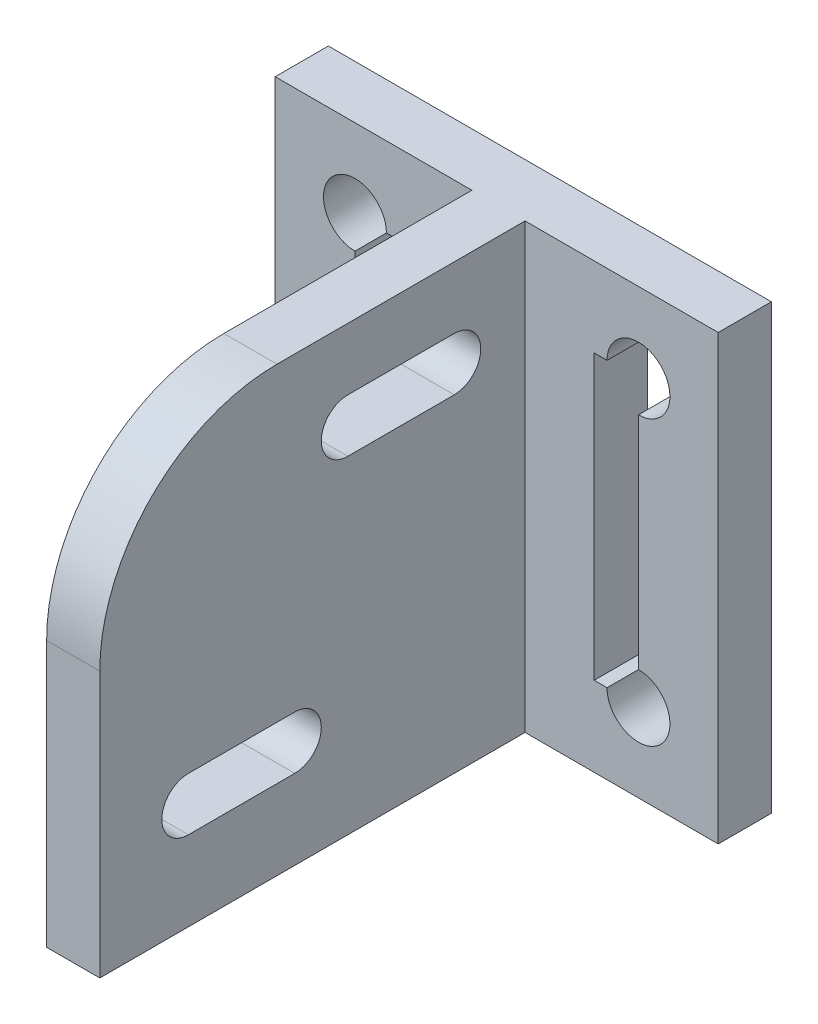
ISO-10303-21;
HEADER;
FILE_DESCRIPTION(('STEP AP214'),'2;1');
FILE_NAME('part.step','',(''),(''),'','','');
FILE_SCHEMA(('AUTOMOTIVE_DESIGN { 1 0 10303 214 1 1 1 1 }'));
ENDSEC;
DATA;
#1=APPLICATION_CONTEXT('core data for automotive mechanical design processes');
#2=APPLICATION_PROTOCOL_DEFINITION('international standard','automotive_design',2000,#1);
#3=PRODUCT_CONTEXT('',#1,'mechanical');
#4=PRODUCT('Part','Part','',(#3));
#5=PRODUCT_RELATED_PRODUCT_CATEGORY('part','',(#4));
#6=PRODUCT_DEFINITION_FORMATION('','',#4);
#7=PRODUCT_DEFINITION_CONTEXT('part definition',#1,'design');
#8=PRODUCT_DEFINITION('design','',#6,#7);
#9=PRODUCT_DEFINITION_SHAPE('','',#8);
#10=(LENGTH_UNIT() NAMED_UNIT(*) SI_UNIT(.MILLI.,.METRE.));
#11=(NAMED_UNIT(*) PLANE_ANGLE_UNIT() SI_UNIT($,.RADIAN.));
#12=(NAMED_UNIT(*) SI_UNIT($,.STERADIAN.) SOLID_ANGLE_UNIT());
#13=UNCERTAINTY_MEASURE_WITH_UNIT(LENGTH_MEASURE(1.E-05),#10,'distance_accuracy_value','');
#14=(GEOMETRIC_REPRESENTATION_CONTEXT(3) GLOBAL_UNCERTAINTY_ASSIGNED_CONTEXT((#13)) GLOBAL_UNIT_ASSIGNED_CONTEXT((#10,
#11,#12)) REPRESENTATION_CONTEXT('',''));
#15=CARTESIAN_POINT('',(0.,0.,0.));
#16=DIRECTION('',(0.,0.,1.));
#17=DIRECTION('',(1.,0.,0.));
#18=AXIS2_PLACEMENT_3D('',#15,#16,#17);
#19=CARTESIAN_POINT('',(0.,0.,3.));
#20=DIRECTION('',(0.,0.,-1.));
#21=DIRECTION('',(-1.,0.,0.));
#22=AXIS2_PLACEMENT_3D('',#19,#20,#21);
#23=PLANE('',#22);
#24=DIRECTION('',(0.,-1.,0.));
#25=VECTOR('',#24,1.);
#26=CARTESIAN_POINT('',(4.5,0.,3.));
#27=LINE('',#26,#25);
#28=CARTESIAN_POINT('',(4.5,18.7249999999999,3.));
#29=VERTEX_POINT('',#28);
#30=CARTESIAN_POINT('',(4.5,6.27500000000003,3.));
#31=VERTEX_POINT('',#30);
#32=EDGE_CURVE('E400',#29,#31,#27,.T.);
#33=ORIENTED_EDGE('',*,*,#32,.F.);
#34=CARTESIAN_POINT('',(4.5,20.5,3.));
#35=DIRECTION('',(0.,0.,-1.));
#36=DIRECTION('',(-1.,0.,0.));
#37=AXIS2_PLACEMENT_3D('',#34,#35,#36);
#38=CIRCLE('',#37,1.775);
#39=CARTESIAN_POINT('',(6.27500000000001,20.5,3.));
#40=VERTEX_POINT('',#39);
#41=EDGE_CURVE('E402',#29,#40,#38,.T.);
#42=ORIENTED_EDGE('',*,*,#41,.T.);
#43=DIRECTION('',(1.,0.,0.));
#44=VECTOR('',#43,1.);
#45=CARTESIAN_POINT('',(0.,20.5,3.));
#46=LINE('',#45,#44);
#47=CARTESIAN_POINT('',(7.00000000000001,20.5,3.));
#48=VERTEX_POINT('',#47);
#49=EDGE_CURVE('E351',#40,#48,#46,.T.);
#50=ORIENTED_EDGE('',*,*,#49,.T.);
#51=DIRECTION('',(0.,-1.,0.));
#52=VECTOR('',#51,1.);
#53=CARTESIAN_POINT('',(7.,0.,3.));
#54=LINE('',#53,#52);
#55=CARTESIAN_POINT('',(7.,4.49999999999995,3.));
#56=VERTEX_POINT('',#55);
#57=EDGE_CURVE('E392',#48,#56,#54,.T.);
#58=ORIENTED_EDGE('',*,*,#57,.T.);
#59=DIRECTION('',(1.,0.,0.));
#60=VECTOR('',#59,1.);
#61=CARTESIAN_POINT('',(0.,4.49999999999995,3.));
#62=LINE('',#61,#60);
#63=CARTESIAN_POINT('',(6.275,4.49999999999995,3.));
#64=VERTEX_POINT('',#63);
#65=EDGE_CURVE('E395',#64,#56,#62,.T.);
#66=ORIENTED_EDGE('',*,*,#65,.F.);
#67=CARTESIAN_POINT('',(4.5,4.49999999999995,3.));
#68=DIRECTION('',(0.,0.,-1.));
#69=DIRECTION('',(-1.,0.,0.));
#70=AXIS2_PLACEMENT_3D('',#67,#68,#69);
#71=CIRCLE('',#70,1.775);
#72=EDGE_CURVE('E397',#64,#31,#71,.T.);
#73=ORIENTED_EDGE('',*,*,#72,.T.);
#74=EDGE_LOOP('',(#33,#42,#50,#58,#66,#73));
#75=FACE_BOUND('',#74,.T.);
#76=DIRECTION('',(0.,-1.,0.));
#77=VECTOR('',#76,1.);
#78=CARTESIAN_POINT('',(11.0999999999924,0.,3.));
#79=LINE('',#78,#77);
#80=CARTESIAN_POINT('',(11.0999999999924,25.,3.));
#81=VERTEX_POINT('',#80);
#82=CARTESIAN_POINT('',(11.0999999999924,0.,3.));
#83=VERTEX_POINT('',#82);
#84=EDGE_CURVE('E306',#81,#83,#79,.T.);
#85=ORIENTED_EDGE('',*,*,#84,.F.);
#86=DIRECTION('',(-1.,0.,0.));
#87=VECTOR('',#86,1.);
#88=CARTESIAN_POINT('',(0.,25.,3.));
#89=LINE('',#88,#87);
#90=CARTESIAN_POINT('',(0.,25.,3.));
#91=VERTEX_POINT('',#90);
#92=EDGE_CURVE('E431',#81,#91,#89,.T.);
#93=ORIENTED_EDGE('',*,*,#92,.T.);
#94=DIRECTION('',(0.,-1.,0.));
#95=VECTOR('',#94,1.);
#96=CARTESIAN_POINT('',(0.,0.,3.));
#97=LINE('',#96,#95);
#98=CARTESIAN_POINT('',(0.,0.,3.));
#99=VERTEX_POINT('',#98);
#100=EDGE_CURVE('E422',#91,#99,#97,.T.);
#101=ORIENTED_EDGE('',*,*,#100,.T.);
#102=DIRECTION('',(1.,0.,0.));
#103=VECTOR('',#102,1.);
#104=CARTESIAN_POINT('',(0.,0.,3.));
#105=LINE('',#104,#103);
#106=EDGE_CURVE('E427',#99,#83,#105,.T.);
#107=ORIENTED_EDGE('',*,*,#106,.T.);
#108=EDGE_LOOP('',(#85,#93,#101,#107));
#109=FACE_BOUND('',#108,.T.);
#110=ADVANCED_FACE('F41',(#75,#109),#23,.F.);
#111=DIRECTION('',(0.,1.,0.));
#112=VECTOR('',#111,1.);
#113=CARTESIAN_POINT('',(20.5,0.,3.));
#114=LINE('',#113,#112);
#115=CARTESIAN_POINT('',(20.5,6.27500000000003,3.));
#116=VERTEX_POINT('',#115);
#117=CARTESIAN_POINT('',(20.5,18.7249999999999,3.));
#118=VERTEX_POINT('',#117);
#119=EDGE_CURVE('E416',#116,#118,#114,.T.);
#120=ORIENTED_EDGE('',*,*,#119,.F.);
#121=CARTESIAN_POINT('',(20.5,4.49999999999995,3.));
#122=DIRECTION('',(0.,0.,-1.));
#123=DIRECTION('',(-1.,0.,0.));
#124=AXIS2_PLACEMENT_3D('',#121,#122,#123);
#125=CIRCLE('',#124,1.775);
#126=CARTESIAN_POINT('',(18.725,4.49999999999995,3.));
#127=VERTEX_POINT('',#126);
#128=EDGE_CURVE('E418',#116,#127,#125,.T.);
#129=ORIENTED_EDGE('',*,*,#128,.T.);
#130=DIRECTION('',(-1.,0.,0.));
#131=VECTOR('',#130,1.);
#132=CARTESIAN_POINT('',(0.,4.49999999999995,3.));
#133=LINE('',#132,#131);
#134=CARTESIAN_POINT('',(18.,4.49999999999995,3.));
#135=VERTEX_POINT('',#134);
#136=EDGE_CURVE('E405',#127,#135,#133,.T.);
#137=ORIENTED_EDGE('',*,*,#136,.T.);
#138=DIRECTION('',(0.,1.,0.));
#139=VECTOR('',#138,1.);
#140=CARTESIAN_POINT('',(18.,0.,3.));
#141=LINE('',#140,#139);
#142=CARTESIAN_POINT('',(18.,20.5,3.));
#143=VERTEX_POINT('',#142);
#144=EDGE_CURVE('E408',#135,#143,#141,.T.);
#145=ORIENTED_EDGE('',*,*,#144,.T.);
#146=DIRECTION('',(-1.,0.,0.));
#147=VECTOR('',#146,1.);
#148=CARTESIAN_POINT('',(0.,20.5,3.));
#149=LINE('',#148,#147);
#150=CARTESIAN_POINT('',(18.725,20.5,3.));
#151=VERTEX_POINT('',#150);
#152=EDGE_CURVE('E411',#151,#143,#149,.T.);
#153=ORIENTED_EDGE('',*,*,#152,.F.);
#154=CARTESIAN_POINT('',(20.5,20.5,3.));
#155=DIRECTION('',(0.,0.,-1.));
#156=DIRECTION('',(-1.,0.,0.));
#157=AXIS2_PLACEMENT_3D('',#154,#155,#156);
#158=CIRCLE('',#157,1.775);
#159=EDGE_CURVE('E413',#151,#118,#158,.T.);
#160=ORIENTED_EDGE('',*,*,#159,.T.);
#161=EDGE_LOOP('',(#120,#129,#137,#145,#153,#160));
#162=FACE_BOUND('',#161,.T.);
#163=DIRECTION('',(0.,1.,0.));
#164=VECTOR('',#163,1.);
#165=CARTESIAN_POINT('',(14.0999999999924,0.,3.));
#166=LINE('',#165,#164);
#167=CARTESIAN_POINT('',(14.0999999999924,0.,3.));
#168=VERTEX_POINT('',#167);
#169=CARTESIAN_POINT('',(14.0999999999924,25.,3.));
#170=VERTEX_POINT('',#169);
#171=EDGE_CURVE('E310',#168,#170,#166,.T.);
#172=ORIENTED_EDGE('',*,*,#171,.F.);
#173=CARTESIAN_POINT('',(25.,0.,3.));
#174=VERTEX_POINT('',#173);
#175=EDGE_CURVE('E425',#168,#174,#105,.T.);
#176=ORIENTED_EDGE('',*,*,#175,.T.);
#177=DIRECTION('',(0.,1.,0.));
#178=VECTOR('',#177,1.);
#179=CARTESIAN_POINT('',(25.,0.,3.));
#180=LINE('',#179,#178);
#181=CARTESIAN_POINT('',(25.,25.,3.));
#182=VERTEX_POINT('',#181);
#183=EDGE_CURVE('E429',#174,#182,#180,.T.);
#184=ORIENTED_EDGE('',*,*,#183,.T.);
#185=EDGE_CURVE('E432',#182,#170,#89,.T.);
#186=ORIENTED_EDGE('',*,*,#185,.T.);
#187=EDGE_LOOP('',(#172,#176,#184,#186));
#188=FACE_BOUND('',#187,.T.);
#189=ADVANCED_FACE('F480',(#162,#188),#23,.F.);
#190=CARTESIAN_POINT('',(0.,0.,3.));
#191=DIRECTION('',(1.,0.,0.));
#192=DIRECTION('',(0.,1.,0.));
#193=AXIS2_PLACEMENT_3D('',#190,#191,#192);
#194=PLANE('',#193);
#195=DIRECTION('',(0.,-1.,0.));
#196=VECTOR('',#195,1.);
#197=CARTESIAN_POINT('',(0.,0.,0.));
#198=LINE('',#197,#196);
#199=CARTESIAN_POINT('',(0.,25.,0.));
#200=VERTEX_POINT('',#199);
#201=CARTESIAN_POINT('',(0.,0.,0.));
#202=VERTEX_POINT('',#201);
#203=EDGE_CURVE('E421',#200,#202,#198,.T.);
#204=ORIENTED_EDGE('',*,*,#203,.T.);
#205=DIRECTION('',(0.,0.,-1.));
#206=VECTOR('',#205,1.);
#207=CARTESIAN_POINT('',(0.,0.,3.));
#208=LINE('',#207,#206);
#209=EDGE_CURVE('E451',#99,#202,#208,.T.);
#210=ORIENTED_EDGE('',*,*,#209,.F.);
#211=ORIENTED_EDGE('',*,*,#100,.F.);
#212=DIRECTION('',(0.,0.,-1.));
#213=VECTOR('',#212,1.);
#214=CARTESIAN_POINT('',(0.,25.,3.));
#215=LINE('',#214,#213);
#216=EDGE_CURVE('E435',#91,#200,#215,.T.);
#217=ORIENTED_EDGE('',*,*,#216,.T.);
#218=EDGE_LOOP('',(#204,#210,#211,#217));
#219=FACE_BOUND('',#218,.T.);
#220=ADVANCED_FACE('F487',(#219),#194,.F.);
#221=CARTESIAN_POINT('',(0.,0.,3.));
#222=DIRECTION('',(0.,1.,0.));
#223=DIRECTION('',(0.,0.,1.));
#224=AXIS2_PLACEMENT_3D('',#221,#222,#223);
#225=PLANE('',#224);
#226=DIRECTION('',(1.,0.,0.));
#227=VECTOR('',#226,1.);
#228=CARTESIAN_POINT('',(0.,0.,0.));
#229=LINE('',#228,#227);
#230=CARTESIAN_POINT('',(25.,0.,0.));
#231=VERTEX_POINT('',#230);
#232=EDGE_CURVE('E438',#202,#231,#229,.T.);
#233=ORIENTED_EDGE('',*,*,#232,.T.);
#234=DIRECTION('',(0.,0.,-1.));
#235=VECTOR('',#234,1.);
#236=CARTESIAN_POINT('',(25.,0.,3.));
#237=LINE('',#236,#235);
#238=EDGE_CURVE('E448',#174,#231,#237,.T.);
#239=ORIENTED_EDGE('',*,*,#238,.F.);
#240=ORIENTED_EDGE('',*,*,#175,.F.);
#241=DIRECTION('',(0.,0.,-1.));
#242=VECTOR('',#241,1.);
#243=CARTESIAN_POINT('',(14.0999999999924,0.,27.));
#244=LINE('',#243,#242);
#245=CARTESIAN_POINT('',(14.0999999999924,0.,27.));
#246=VERTEX_POINT('',#245);
#247=EDGE_CURVE('E323',#246,#168,#244,.T.);
#248=ORIENTED_EDGE('',*,*,#247,.F.);
#249=DIRECTION('',(1.,0.,0.));
#250=VECTOR('',#249,1.);
#251=CARTESIAN_POINT('',(11.0999999999924,0.,27.));
#252=LINE('',#251,#250);
#253=CARTESIAN_POINT('',(11.0999999999924,0.,27.));
#254=VERTEX_POINT('',#253);
#255=EDGE_CURVE('E309',#254,#246,#252,.T.);
#256=ORIENTED_EDGE('',*,*,#255,.F.);
#257=DIRECTION('',(0.,0.,-1.));
#258=VECTOR('',#257,1.);
#259=CARTESIAN_POINT('',(11.0999999999924,0.,27.));
#260=LINE('',#259,#258);
#261=EDGE_CURVE('E326',#254,#83,#260,.T.);
#262=ORIENTED_EDGE('',*,*,#261,.T.);
#263=ORIENTED_EDGE('',*,*,#106,.F.);
#264=ORIENTED_EDGE('',*,*,#209,.T.);
#265=EDGE_LOOP('',(#233,#239,#240,#248,#256,#262,#263,#264));
#266=FACE_BOUND('',#265,.T.);
#267=ADVANCED_FACE('F468',(#266),#225,.F.);
#268=CARTESIAN_POINT('',(25.,0.,3.));
#269=DIRECTION('',(-1.,0.,0.));
#270=DIRECTION('',(0.,0.,1.));
#271=AXIS2_PLACEMENT_3D('',#268,#269,#270);
#272=PLANE('',#271);
#273=DIRECTION('',(0.,1.,0.));
#274=VECTOR('',#273,1.);
#275=CARTESIAN_POINT('',(25.,0.,0.));
#276=LINE('',#275,#274);
#277=CARTESIAN_POINT('',(25.,25.,0.));
#278=VERTEX_POINT('',#277);
#279=EDGE_CURVE('E440',#231,#278,#276,.T.);
#280=ORIENTED_EDGE('',*,*,#279,.T.);
#281=DIRECTION('',(0.,0.,-1.));
#282=VECTOR('',#281,1.);
#283=CARTESIAN_POINT('',(25.,25.,3.));
#284=LINE('',#283,#282);
#285=EDGE_CURVE('E445',#182,#278,#284,.T.);
#286=ORIENTED_EDGE('',*,*,#285,.F.);
#287=ORIENTED_EDGE('',*,*,#183,.F.);
#288=ORIENTED_EDGE('',*,*,#238,.T.);
#289=EDGE_LOOP('',(#280,#286,#287,#288));
#290=FACE_BOUND('',#289,.T.);
#291=ADVANCED_FACE('F502',(#290),#272,.F.);
#292=CARTESIAN_POINT('',(0.,25.,3.));
#293=DIRECTION('',(0.,-1.,0.));
#294=DIRECTION('',(0.,0.,-1.));
#295=AXIS2_PLACEMENT_3D('',#292,#293,#294);
#296=PLANE('',#295);
#297=DIRECTION('',(0.,0.,-1.));
#298=VECTOR('',#297,1.);
#299=CARTESIAN_POINT('',(11.0999999999924,25.,27.));
#300=LINE('',#299,#298);
#301=CARTESIAN_POINT('',(11.0999999999924,25.,17.));
#302=VERTEX_POINT('',#301);
#303=EDGE_CURVE('E315',#302,#81,#300,.T.);
#304=ORIENTED_EDGE('',*,*,#303,.F.);
#305=DIRECTION('',(-1.,0.,0.));
#306=VECTOR('',#305,1.);
#307=CARTESIAN_POINT('',(0.,25.,17.));
#308=LINE('',#307,#306);
#309=CARTESIAN_POINT('',(14.0999999999924,25.,17.));
#310=VERTEX_POINT('',#309);
#311=EDGE_CURVE('E49',#302,#310,#308,.F.);
#312=ORIENTED_EDGE('',*,*,#311,.T.);
#313=DIRECTION('',(0.,0.,-1.));
#314=VECTOR('',#313,1.);
#315=CARTESIAN_POINT('',(14.0999999999924,25.,27.));
#316=LINE('',#315,#314);
#317=EDGE_CURVE('E321',#310,#170,#316,.T.);
#318=ORIENTED_EDGE('',*,*,#317,.T.);
#319=ORIENTED_EDGE('',*,*,#185,.F.);
#320=ORIENTED_EDGE('',*,*,#285,.T.);
#321=DIRECTION('',(-1.,0.,0.));
#322=VECTOR('',#321,1.);
#323=CARTESIAN_POINT('',(0.,25.,0.));
#324=LINE('',#323,#322);
#325=EDGE_CURVE('E426',#278,#200,#324,.T.);
#326=ORIENTED_EDGE('',*,*,#325,.T.);
#327=ORIENTED_EDGE('',*,*,#216,.F.);
#328=ORIENTED_EDGE('',*,*,#92,.F.);
#329=EDGE_LOOP('',(#304,#312,#318,#319,#320,#326,#327,#328));
#330=FACE_BOUND('',#329,.T.);
#331=ADVANCED_FACE('F498',(#330),#296,.F.);
#332=CARTESIAN_POINT('',(0.,0.,0.));
#333=DIRECTION('',(0.,0.,-1.));
#334=DIRECTION('',(-1.,0.,0.));
#335=AXIS2_PLACEMENT_3D('',#332,#333,#334);
#336=PLANE('',#335);
#337=CARTESIAN_POINT('',(20.5,4.49999999999995,-1.196959198424E-13));
#338=DIRECTION('',(0.,0.,-1.));
#339=DIRECTION('',(-1.,0.,0.));
#340=AXIS2_PLACEMENT_3D('',#337,#338,#339);
#341=CIRCLE('',#340,1.775);
#342=CARTESIAN_POINT('',(20.5,6.27500000000003,0.));
#343=VERTEX_POINT('',#342);
#344=CARTESIAN_POINT('',(18.725,4.49999999999995,0.));
#345=VERTEX_POINT('',#344);
#346=EDGE_CURVE('E330',#343,#345,#341,.T.);
#347=ORIENTED_EDGE('',*,*,#346,.F.);
#348=DIRECTION('',(0.,1.,0.));
#349=VECTOR('',#348,1.);
#350=CARTESIAN_POINT('',(20.5,0.,0.));
#351=LINE('',#350,#349);
#352=CARTESIAN_POINT('',(20.5,18.7249999999999,-2.72351585728359E-13));
#353=VERTEX_POINT('',#352);
#354=EDGE_CURVE('E345',#343,#353,#351,.T.);
#355=ORIENTED_EDGE('',*,*,#354,.T.);
#356=CARTESIAN_POINT('',(20.5,20.5,-3.72965547335014E-13));
#357=DIRECTION('',(0.,0.,-1.));
#358=DIRECTION('',(-1.,0.,0.));
#359=AXIS2_PLACEMENT_3D('',#356,#357,#358);
#360=CIRCLE('',#359,1.775);
#361=CARTESIAN_POINT('',(18.725,20.5,-2.72351585728359E-13));
#362=VERTEX_POINT('',#361);
#363=EDGE_CURVE('E342',#362,#353,#360,.T.);
#364=ORIENTED_EDGE('',*,*,#363,.F.);
#365=DIRECTION('',(-1.,0.,0.));
#366=VECTOR('',#365,1.);
#367=CARTESIAN_POINT('',(0.,20.5,0.));
#368=LINE('',#367,#366);
#369=CARTESIAN_POINT('',(18.,20.5,0.));
#370=VERTEX_POINT('',#369);
#371=EDGE_CURVE('E339',#362,#370,#368,.T.);
#372=ORIENTED_EDGE('',*,*,#371,.T.);
#373=DIRECTION('',(0.,1.,0.));
#374=VECTOR('',#373,1.);
#375=CARTESIAN_POINT('',(18.,0.,0.));
#376=LINE('',#375,#374);
#377=CARTESIAN_POINT('',(18.,4.49999999999995,0.));
#378=VERTEX_POINT('',#377);
#379=EDGE_CURVE('E336',#378,#370,#376,.T.);
#380=ORIENTED_EDGE('',*,*,#379,.F.);
#381=DIRECTION('',(-1.,0.,0.));
#382=VECTOR('',#381,1.);
#383=CARTESIAN_POINT('',(0.,4.49999999999995,0.));
#384=LINE('',#383,#382);
#385=EDGE_CURVE('E332',#345,#378,#384,.T.);
#386=ORIENTED_EDGE('',*,*,#385,.F.);
#387=EDGE_LOOP('',(#347,#355,#364,#372,#380,#386));
#388=FACE_BOUND('',#387,.T.);
#389=CARTESIAN_POINT('',(4.5,20.5,-4.9439619065339E-13));
#390=DIRECTION('',(0.,0.,-1.));
#391=DIRECTION('',(-1.,0.,0.));
#392=AXIS2_PLACEMENT_3D('',#389,#390,#391);
#393=CIRCLE('',#392,1.775);
#394=CARTESIAN_POINT('',(4.5,18.7249999999999,-5.13478148889135E-13));
#395=VERTEX_POINT('',#394);
#396=CARTESIAN_POINT('',(6.27500000000001,20.5,0.));
#397=VERTEX_POINT('',#396);
#398=EDGE_CURVE('E329',#395,#397,#393,.T.);
#399=ORIENTED_EDGE('',*,*,#398,.F.);
#400=DIRECTION('',(0.,-1.,0.));
#401=VECTOR('',#400,1.);
#402=CARTESIAN_POINT('',(4.5,0.,0.));
#403=LINE('',#402,#401);
#404=CARTESIAN_POINT('',(4.5,6.27500000000003,0.));
#405=VERTEX_POINT('',#404);
#406=EDGE_CURVE('E375',#395,#405,#403,.T.);
#407=ORIENTED_EDGE('',*,*,#406,.T.);
#408=CARTESIAN_POINT('',(4.5,4.49999999999995,-6.41847686111419E-13));
#409=DIRECTION('',(0.,0.,-1.));
#410=DIRECTION('',(-1.,0.,0.));
#411=AXIS2_PLACEMENT_3D('',#408,#409,#410);
#412=CIRCLE('',#411,1.775);
#413=CARTESIAN_POINT('',(6.275,4.49999999999995,-6.08887940067859E-13));
#414=VERTEX_POINT('',#413);
#415=EDGE_CURVE('E372',#414,#405,#412,.T.);
#416=ORIENTED_EDGE('',*,*,#415,.F.);
#417=DIRECTION('',(1.,0.,0.));
#418=VECTOR('',#417,1.);
#419=CARTESIAN_POINT('',(0.,4.49999999999995,-5.39499001028787E-13));
#420=LINE('',#419,#418);
#421=CARTESIAN_POINT('',(7.,4.49999999999995,-5.39499001028787E-13));
#422=VERTEX_POINT('',#421);
#423=EDGE_CURVE('E369',#414,#422,#420,.T.);
#424=ORIENTED_EDGE('',*,*,#423,.T.);
#425=DIRECTION('',(0.,-1.,0.));
#426=VECTOR('',#425,1.);
#427=CARTESIAN_POINT('',(7.,0.,0.));
#428=LINE('',#427,#426);
#429=CARTESIAN_POINT('',(7.00000000000001,20.5,-5.39499001028787E-13));
#430=VERTEX_POINT('',#429);
#431=EDGE_CURVE('E366',#430,#422,#428,.T.);
#432=ORIENTED_EDGE('',*,*,#431,.F.);
#433=DIRECTION('',(1.,0.,0.));
#434=VECTOR('',#433,1.);
#435=CARTESIAN_POINT('',(0.,20.5,-5.39499001028787E-13));
#436=LINE('',#435,#434);
#437=EDGE_CURVE('E363',#397,#430,#436,.T.);
#438=ORIENTED_EDGE('',*,*,#437,.F.);
#439=EDGE_LOOP('',(#399,#407,#416,#424,#432,#438));
#440=FACE_BOUND('',#439,.T.);
#441=ORIENTED_EDGE('',*,*,#203,.F.);
#442=ORIENTED_EDGE('',*,*,#325,.F.);
#443=ORIENTED_EDGE('',*,*,#279,.F.);
#444=ORIENTED_EDGE('',*,*,#232,.F.);
#445=EDGE_LOOP('',(#441,#442,#443,#444));
#446=FACE_BOUND('',#445,.T.);
#447=ADVANCED_FACE('F495',(#388,#440,#446),#336,.T.);
#448=CARTESIAN_POINT('',(4.5,20.5,9.99999999999951));
#449=DIRECTION('',(0.,0.,-1.));
#450=DIRECTION('',(-1.,0.,0.));
#451=AXIS2_PLACEMENT_3D('',#448,#449,#450);
#452=CYLINDRICAL_SURFACE('',#451,1.775);
#453=DIRECTION('',(0.,0.,-1.));
#454=VECTOR('',#453,1.);
#455=CARTESIAN_POINT('',(4.5,18.7249999999999,9.99999999999949));
#456=LINE('',#455,#454);
#457=EDGE_CURVE('E333',#29,#395,#456,.T.);
#458=ORIENTED_EDGE('',*,*,#457,.T.);
#459=ORIENTED_EDGE('',*,*,#398,.T.);
#460=DIRECTION('',(0.,0.,-1.));
#461=VECTOR('',#460,1.);
#462=CARTESIAN_POINT('',(6.27500000000001,20.5,9.99999999999949));
#463=LINE('',#462,#461);
#464=EDGE_CURVE('E378',#40,#397,#463,.T.);
#465=ORIENTED_EDGE('',*,*,#464,.F.);
#466=ORIENTED_EDGE('',*,*,#41,.F.);
#467=EDGE_LOOP('',(#458,#459,#465,#466));
#468=FACE_BOUND('',#467,.T.);
#469=ADVANCED_FACE('F493',(#468),#452,.F.);
#470=CARTESIAN_POINT('',(4.5,0.,10.));
#471=DIRECTION('',(1.,0.,0.));
#472=DIRECTION('',(0.,1.,0.));
#473=AXIS2_PLACEMENT_3D('',#470,#471,#472);
#474=PLANE('',#473);
#475=ORIENTED_EDGE('',*,*,#32,.T.);
#476=DIRECTION('',(0.,0.,-1.));
#477=VECTOR('',#476,1.);
#478=CARTESIAN_POINT('',(4.5,6.27500000000003,10.));
#479=LINE('',#478,#477);
#480=EDGE_CURVE('E380',#31,#405,#479,.T.);
#481=ORIENTED_EDGE('',*,*,#480,.T.);
#482=ORIENTED_EDGE('',*,*,#406,.F.);
#483=ORIENTED_EDGE('',*,*,#457,.F.);
#484=EDGE_LOOP('',(#475,#481,#482,#483));
#485=FACE_BOUND('',#484,.T.);
#486=ADVANCED_FACE('F542',(#485),#474,.T.);
#487=CARTESIAN_POINT('',(4.5,4.49999999999995,9.99999999999936));
#488=DIRECTION('',(0.,0.,-1.));
#489=DIRECTION('',(-1.,0.,0.));
#490=AXIS2_PLACEMENT_3D('',#487,#488,#489);
#491=CYLINDRICAL_SURFACE('',#490,1.775);
#492=DIRECTION('',(0.,0.,-1.));
#493=VECTOR('',#492,1.);
#494=CARTESIAN_POINT('',(6.275,4.49999999999995,9.99999999999939));
#495=LINE('',#494,#493);
#496=EDGE_CURVE('E382',#64,#414,#495,.T.);
#497=ORIENTED_EDGE('',*,*,#496,.T.);
#498=ORIENTED_EDGE('',*,*,#415,.T.);
#499=ORIENTED_EDGE('',*,*,#480,.F.);
#500=ORIENTED_EDGE('',*,*,#72,.F.);
#501=EDGE_LOOP('',(#497,#498,#499,#500));
#502=FACE_BOUND('',#501,.T.);
#503=ADVANCED_FACE('F550',(#502),#491,.F.);
#504=CARTESIAN_POINT('',(0.,4.49999999999995,9.99999999999946));
#505=DIRECTION('',(0.,1.,0.));
#506=DIRECTION('',(-1.,0.,0.));
#507=AXIS2_PLACEMENT_3D('',#504,#505,#506);
#508=PLANE('',#507);
#509=ORIENTED_EDGE('',*,*,#65,.T.);
#510=DIRECTION('',(0.,0.,-1.));
#511=VECTOR('',#510,1.);
#512=CARTESIAN_POINT('',(7.,4.49999999999995,9.99999999999946));
#513=LINE('',#512,#511);
#514=EDGE_CURVE('E384',#56,#422,#513,.T.);
#515=ORIENTED_EDGE('',*,*,#514,.T.);
#516=ORIENTED_EDGE('',*,*,#423,.F.);
#517=ORIENTED_EDGE('',*,*,#496,.F.);
#518=EDGE_LOOP('',(#509,#515,#516,#517));
#519=FACE_BOUND('',#518,.T.);
#520=ADVANCED_FACE('F559',(#519),#508,.T.);
#521=CARTESIAN_POINT('',(7.,0.,10.));
#522=DIRECTION('',(1.,0.,0.));
#523=DIRECTION('',(0.,1.,0.));
#524=AXIS2_PLACEMENT_3D('',#521,#522,#523);
#525=PLANE('',#524);
#526=DIRECTION('',(0.,0.,-1.));
#527=VECTOR('',#526,1.);
#528=CARTESIAN_POINT('',(7.00000000000001,20.5,9.99999999999946));
#529=LINE('',#528,#527);
#530=EDGE_CURVE('E386',#48,#430,#529,.T.);
#531=ORIENTED_EDGE('',*,*,#530,.T.);
#532=ORIENTED_EDGE('',*,*,#431,.T.);
#533=ORIENTED_EDGE('',*,*,#514,.F.);
#534=ORIENTED_EDGE('',*,*,#57,.F.);
#535=EDGE_LOOP('',(#531,#532,#533,#534));
#536=FACE_BOUND('',#535,.T.);
#537=ADVANCED_FACE('F568',(#536),#525,.F.);
#538=CARTESIAN_POINT('',(0.,20.5,9.99999999999946));
#539=DIRECTION('',(0.,1.,0.));
#540=DIRECTION('',(-1.,0.,0.));
#541=AXIS2_PLACEMENT_3D('',#538,#539,#540);
#542=PLANE('',#541);
#543=ORIENTED_EDGE('',*,*,#464,.T.);
#544=ORIENTED_EDGE('',*,*,#437,.T.);
#545=ORIENTED_EDGE('',*,*,#530,.F.);
#546=ORIENTED_EDGE('',*,*,#49,.F.);
#547=EDGE_LOOP('',(#543,#544,#545,#546));
#548=FACE_BOUND('',#547,.T.);
#549=ADVANCED_FACE('F577',(#548),#542,.F.);
#550=CARTESIAN_POINT('',(20.5,4.49999999999995,9.99999999999988));
#551=DIRECTION('',(0.,0.,-1.));
#552=DIRECTION('',(-1.,0.,0.));
#553=AXIS2_PLACEMENT_3D('',#550,#551,#552);
#554=CYLINDRICAL_SURFACE('',#553,1.775);
#555=DIRECTION('',(0.,0.,-1.));
#556=VECTOR('',#555,1.);
#557=CARTESIAN_POINT('',(20.5,6.27500000000003,10.));
#558=LINE('',#557,#556);
#559=EDGE_CURVE('E349',#116,#343,#558,.T.);
#560=ORIENTED_EDGE('',*,*,#559,.T.);
#561=ORIENTED_EDGE('',*,*,#346,.T.);
#562=DIRECTION('',(0.,0.,-1.));
#563=VECTOR('',#562,1.);
#564=CARTESIAN_POINT('',(18.725,4.49999999999995,9.99999999999994));
#565=LINE('',#564,#563);
#566=EDGE_CURVE('E348',#127,#345,#565,.T.);
#567=ORIENTED_EDGE('',*,*,#566,.F.);
#568=ORIENTED_EDGE('',*,*,#128,.F.);
#569=EDGE_LOOP('',(#560,#561,#567,#568));
#570=FACE_BOUND('',#569,.T.);
#571=ADVANCED_FACE('F586',(#570),#554,.F.);
#572=CARTESIAN_POINT('',(20.5,0.,10.));
#573=DIRECTION('',(-1.,0.,0.));
#574=DIRECTION('',(0.,-1.,0.));
#575=AXIS2_PLACEMENT_3D('',#572,#573,#574);
#576=PLANE('',#575);
#577=ORIENTED_EDGE('',*,*,#119,.T.);
#578=DIRECTION('',(0.,0.,-1.));
#579=VECTOR('',#578,1.);
#580=CARTESIAN_POINT('',(20.5,18.7249999999999,9.99999999999973));
#581=LINE('',#580,#579);
#582=EDGE_CURVE('E352',#118,#353,#581,.T.);
#583=ORIENTED_EDGE('',*,*,#582,.T.);
#584=ORIENTED_EDGE('',*,*,#354,.F.);
#585=ORIENTED_EDGE('',*,*,#559,.F.);
#586=EDGE_LOOP('',(#577,#583,#584,#585));
#587=FACE_BOUND('',#586,.T.);
#588=ADVANCED_FACE('F594',(#587),#576,.T.);
#589=CARTESIAN_POINT('',(20.5,20.5,9.99999999999963));
#590=DIRECTION('',(0.,0.,-1.));
#591=DIRECTION('',(-1.,0.,0.));
#592=AXIS2_PLACEMENT_3D('',#589,#590,#591);
#593=CYLINDRICAL_SURFACE('',#592,1.775);
#594=DIRECTION('',(0.,0.,-1.));
#595=VECTOR('',#594,1.);
#596=CARTESIAN_POINT('',(18.725,20.5,9.99999999999973));
#597=LINE('',#596,#595);
#598=EDGE_CURVE('E354',#151,#362,#597,.T.);
#599=ORIENTED_EDGE('',*,*,#598,.T.);
#600=ORIENTED_EDGE('',*,*,#363,.T.);
#601=ORIENTED_EDGE('',*,*,#582,.F.);
#602=ORIENTED_EDGE('',*,*,#159,.F.);
#603=EDGE_LOOP('',(#599,#600,#601,#602));
#604=FACE_BOUND('',#603,.T.);
#605=ADVANCED_FACE('F603',(#604),#593,.F.);
#606=CARTESIAN_POINT('',(0.,20.5,9.99999999999999));
#607=DIRECTION('',(0.,-1.,0.));
#608=DIRECTION('',(1.,0.,0.));
#609=AXIS2_PLACEMENT_3D('',#606,#607,#608);
#610=PLANE('',#609);
#611=ORIENTED_EDGE('',*,*,#152,.T.);
#612=DIRECTION('',(0.,0.,-1.));
#613=VECTOR('',#612,1.);
#614=CARTESIAN_POINT('',(18.,20.5,9.99999999999999));
#615=LINE('',#614,#613);
#616=EDGE_CURVE('E356',#143,#370,#615,.T.);
#617=ORIENTED_EDGE('',*,*,#616,.T.);
#618=ORIENTED_EDGE('',*,*,#371,.F.);
#619=ORIENTED_EDGE('',*,*,#598,.F.);
#620=EDGE_LOOP('',(#611,#617,#618,#619));
#621=FACE_BOUND('',#620,.T.);
#622=ADVANCED_FACE('F612',(#621),#610,.T.);
#623=CARTESIAN_POINT('',(18.,0.,10.));
#624=DIRECTION('',(-1.,0.,0.));
#625=DIRECTION('',(0.,-1.,0.));
#626=AXIS2_PLACEMENT_3D('',#623,#624,#625);
#627=PLANE('',#626);
#628=DIRECTION('',(0.,0.,-1.));
#629=VECTOR('',#628,1.);
#630=CARTESIAN_POINT('',(18.,4.49999999999995,9.99999999999999));
#631=LINE('',#630,#629);
#632=EDGE_CURVE('E358',#135,#378,#631,.T.);
#633=ORIENTED_EDGE('',*,*,#632,.T.);
#634=ORIENTED_EDGE('',*,*,#379,.T.);
#635=ORIENTED_EDGE('',*,*,#616,.F.);
#636=ORIENTED_EDGE('',*,*,#144,.F.);
#637=EDGE_LOOP('',(#633,#634,#635,#636));
#638=FACE_BOUND('',#637,.T.);
#639=ADVANCED_FACE('F621',(#638),#627,.F.);
#640=CARTESIAN_POINT('',(0.,4.49999999999995,9.99999999999999));
#641=DIRECTION('',(0.,-1.,0.));
#642=DIRECTION('',(1.,0.,0.));
#643=AXIS2_PLACEMENT_3D('',#640,#641,#642);
#644=PLANE('',#643);
#645=ORIENTED_EDGE('',*,*,#566,.T.);
#646=ORIENTED_EDGE('',*,*,#385,.T.);
#647=ORIENTED_EDGE('',*,*,#632,.F.);
#648=ORIENTED_EDGE('',*,*,#136,.F.);
#649=EDGE_LOOP('',(#645,#646,#647,#648));
#650=FACE_BOUND('',#649,.T.);
#651=ADVANCED_FACE('F629',(#650),#644,.F.);
#652=CARTESIAN_POINT('',(11.0999999999924,0.,27.));
#653=DIRECTION('',(1.,0.,0.));
#654=DIRECTION('',(0.,0.,-1.));
#655=AXIS2_PLACEMENT_3D('',#652,#653,#654);
#656=PLANE('',#655);
#657=DIRECTION('',(0.,0.,1.));
#658=VECTOR('',#657,1.);
#659=CARTESIAN_POINT('',(11.0999999999924,7.5,27.));
#660=LINE('',#659,#658);
#661=CARTESIAN_POINT('',(11.0999999999924,7.5,16.));
#662=VERTEX_POINT('',#661);
#663=CARTESIAN_POINT('',(11.0999999999924,7.5,22.));
#664=VERTEX_POINT('',#663);
#665=EDGE_CURVE('E300',#662,#664,#660,.T.);
#666=ORIENTED_EDGE('',*,*,#665,.T.);
#667=CARTESIAN_POINT('',(11.0999999999924,6.,22.));
#668=DIRECTION('',(1.,0.,0.));
#669=DIRECTION('',(0.,0.,-1.));
#670=AXIS2_PLACEMENT_3D('',#667,#668,#669);
#671=CIRCLE('',#670,1.5);
#672=CARTESIAN_POINT('',(11.0999999999924,4.5,22.));
#673=VERTEX_POINT('',#672);
#674=EDGE_CURVE('E303',#664,#673,#671,.T.);
#675=ORIENTED_EDGE('',*,*,#674,.T.);
#676=DIRECTION('',(0.,0.,-1.));
#677=VECTOR('',#676,1.);
#678=CARTESIAN_POINT('',(11.0999999999924,4.5,27.));
#679=LINE('',#678,#677);
#680=CARTESIAN_POINT('',(11.0999999999924,4.5,16.));
#681=VERTEX_POINT('',#680);
#682=EDGE_CURVE('E297',#673,#681,#679,.T.);
#683=ORIENTED_EDGE('',*,*,#682,.T.);
#684=CARTESIAN_POINT('',(11.0999999999924,6.,16.));
#685=DIRECTION('',(1.,0.,0.));
#686=DIRECTION('',(0.,0.,-1.));
#687=AXIS2_PLACEMENT_3D('',#684,#685,#686);
#688=CIRCLE('',#687,1.5);
#689=EDGE_CURVE('E238',#681,#662,#688,.T.);
#690=ORIENTED_EDGE('',*,*,#689,.T.);
#691=EDGE_LOOP('',(#666,#675,#683,#690));
#692=FACE_BOUND('',#691,.T.);
#693=DIRECTION('',(0.,0.,-1.));
#694=VECTOR('',#693,1.);
#695=CARTESIAN_POINT('',(11.0999999999924,18.5,27.));
#696=LINE('',#695,#694);
#697=CARTESIAN_POINT('',(11.0999999999924,18.5,12.9999999999998));
#698=VERTEX_POINT('',#697);
#699=CARTESIAN_POINT('',(11.0999999999924,18.5,6.99999999999979));
#700=VERTEX_POINT('',#699);
#701=EDGE_CURVE('E291',#698,#700,#696,.T.);
#702=ORIENTED_EDGE('',*,*,#701,.T.);
#703=CARTESIAN_POINT('',(11.0999999999924,20.,6.99999999999979));
#704=DIRECTION('',(1.,0.,0.));
#705=DIRECTION('',(0.,0.,-1.));
#706=AXIS2_PLACEMENT_3D('',#703,#704,#705);
#707=CIRCLE('',#706,1.5);
#708=CARTESIAN_POINT('',(11.0999999999924,21.5,6.99999999999979));
#709=VERTEX_POINT('',#708);
#710=EDGE_CURVE('E294',#700,#709,#707,.T.);
#711=ORIENTED_EDGE('',*,*,#710,.T.);
#712=DIRECTION('',(0.,0.,1.));
#713=VECTOR('',#712,1.);
#714=CARTESIAN_POINT('',(11.0999999999924,21.5,27.));
#715=LINE('',#714,#713);
#716=CARTESIAN_POINT('',(11.0999999999924,21.5,12.9999999999998));
#717=VERTEX_POINT('',#716);
#718=EDGE_CURVE('E263',#709,#717,#715,.T.);
#719=ORIENTED_EDGE('',*,*,#718,.T.);
#720=CARTESIAN_POINT('',(11.0999999999924,20.,12.9999999999998));
#721=DIRECTION('',(1.,0.,0.));
#722=DIRECTION('',(0.,0.,-1.));
#723=AXIS2_PLACEMENT_3D('',#720,#721,#722);
#724=CIRCLE('',#723,1.5);
#725=EDGE_CURVE('E288',#717,#698,#724,.T.);
#726=ORIENTED_EDGE('',*,*,#725,.T.);
#727=EDGE_LOOP('',(#702,#711,#719,#726));
#728=FACE_BOUND('',#727,.T.);
#729=DIRECTION('',(0.,-1.,0.));
#730=VECTOR('',#729,1.);
#731=CARTESIAN_POINT('',(11.0999999999924,0.,27.));
#732=LINE('',#731,#730);
#733=CARTESIAN_POINT('',(11.0999999999924,15.,27.));
#734=VERTEX_POINT('',#733);
#735=EDGE_CURVE('E307',#734,#254,#732,.T.);
#736=ORIENTED_EDGE('',*,*,#735,.F.);
#737=CARTESIAN_POINT('',(11.0999999999924,15.,17.));
#738=DIRECTION('',(1.,0.,0.));
#739=DIRECTION('',(0.,0.,-1.));
#740=AXIS2_PLACEMENT_3D('',#737,#738,#739);
#741=CIRCLE('',#740,10.);
#742=EDGE_CURVE('E63',#734,#302,#741,.F.);
#743=ORIENTED_EDGE('',*,*,#742,.T.);
#744=ORIENTED_EDGE('',*,*,#303,.T.);
#745=ORIENTED_EDGE('',*,*,#84,.T.);
#746=ORIENTED_EDGE('',*,*,#261,.F.);
#747=EDGE_LOOP('',(#736,#743,#744,#745,#746));
#748=FACE_BOUND('',#747,.T.);
#749=ADVANCED_FACE('F465',(#692,#728,#748),#656,.F.);
#750=CARTESIAN_POINT('',(14.0999999999924,0.,27.));
#751=DIRECTION('',(-1.,0.,0.));
#752=DIRECTION('',(0.,0.,1.));
#753=AXIS2_PLACEMENT_3D('',#750,#751,#752);
#754=PLANE('',#753);
#755=DIRECTION('',(0.,0.,-1.));
#756=VECTOR('',#755,1.);
#757=CARTESIAN_POINT('',(14.0999999999924,4.5,22.));
#758=LINE('',#757,#756);
#759=CARTESIAN_POINT('',(14.0999999999924,4.5,22.));
#760=VERTEX_POINT('',#759);
#761=CARTESIAN_POINT('',(14.0999999999924,4.5,16.));
#762=VERTEX_POINT('',#761);
#763=EDGE_CURVE('E246',#760,#762,#758,.T.);
#764=ORIENTED_EDGE('',*,*,#763,.F.);
#765=CARTESIAN_POINT('',(14.0999999999924,6.,22.));
#766=DIRECTION('',(1.,0.,0.));
#767=DIRECTION('',(0.,0.,-1.));
#768=AXIS2_PLACEMENT_3D('',#765,#766,#767);
#769=CIRCLE('',#768,1.5);
#770=CARTESIAN_POINT('',(14.0999999999924,7.5,22.));
#771=VERTEX_POINT('',#770);
#772=EDGE_CURVE('E251',#771,#760,#769,.T.);
#773=ORIENTED_EDGE('',*,*,#772,.F.);
#774=DIRECTION('',(0.,0.,1.));
#775=VECTOR('',#774,1.);
#776=CARTESIAN_POINT('',(14.0999999999924,7.5,22.));
#777=LINE('',#776,#775);
#778=CARTESIAN_POINT('',(14.0999999999924,7.5,16.));
#779=VERTEX_POINT('',#778);
#780=EDGE_CURVE('E256',#779,#771,#777,.T.);
#781=ORIENTED_EDGE('',*,*,#780,.F.);
#782=CARTESIAN_POINT('',(14.0999999999924,6.,16.));
#783=DIRECTION('',(1.,0.,0.));
#784=DIRECTION('',(0.,0.,-1.));
#785=AXIS2_PLACEMENT_3D('',#782,#783,#784);
#786=CIRCLE('',#785,1.5);
#787=EDGE_CURVE('E235',#762,#779,#786,.T.);
#788=ORIENTED_EDGE('',*,*,#787,.F.);
#789=EDGE_LOOP('',(#764,#773,#781,#788));
#790=FACE_BOUND('',#789,.T.);
#791=DIRECTION('',(0.,0.,1.));
#792=VECTOR('',#791,1.);
#793=CARTESIAN_POINT('',(14.0999999999924,21.5,6.99999999999979));
#794=LINE('',#793,#792);
#795=CARTESIAN_POINT('',(14.0999999999924,21.5,6.9999999999998));
#796=VERTEX_POINT('',#795);
#797=CARTESIAN_POINT('',(14.0999999999924,21.5,12.9999999999998));
#798=VERTEX_POINT('',#797);
#799=EDGE_CURVE('E281',#796,#798,#794,.T.);
#800=ORIENTED_EDGE('',*,*,#799,.F.);
#801=CARTESIAN_POINT('',(14.0999999999924,20.,6.99999999999979));
#802=DIRECTION('',(1.,0.,0.));
#803=DIRECTION('',(0.,0.,-1.));
#804=AXIS2_PLACEMENT_3D('',#801,#802,#803);
#805=CIRCLE('',#804,1.5);
#806=CARTESIAN_POINT('',(14.0999999999924,18.5,6.99999999999979));
#807=VERTEX_POINT('',#806);
#808=EDGE_CURVE('E284',#807,#796,#805,.T.);
#809=ORIENTED_EDGE('',*,*,#808,.F.);
#810=DIRECTION('',(0.,0.,-1.));
#811=VECTOR('',#810,1.);
#812=CARTESIAN_POINT('',(14.0999999999924,18.5,6.99999999999979));
#813=LINE('',#812,#811);
#814=CARTESIAN_POINT('',(14.0999999999924,18.5,12.9999999999998));
#815=VERTEX_POINT('',#814);
#816=EDGE_CURVE('E269',#815,#807,#813,.T.);
#817=ORIENTED_EDGE('',*,*,#816,.F.);
#818=CARTESIAN_POINT('',(14.0999999999924,20.,12.9999999999998));
#819=DIRECTION('',(1.,0.,0.));
#820=DIRECTION('',(0.,0.,-1.));
#821=AXIS2_PLACEMENT_3D('',#818,#819,#820);
#822=CIRCLE('',#821,1.5);
#823=EDGE_CURVE('E278',#798,#815,#822,.T.);
#824=ORIENTED_EDGE('',*,*,#823,.F.);
#825=EDGE_LOOP('',(#800,#809,#817,#824));
#826=FACE_BOUND('',#825,.T.);
#827=ORIENTED_EDGE('',*,*,#317,.F.);
#828=CARTESIAN_POINT('',(14.0999999999924,15.,17.));
#829=DIRECTION('',(-1.,0.,0.));
#830=DIRECTION('',(0.,0.,1.));
#831=AXIS2_PLACEMENT_3D('',#828,#829,#830);
#832=CIRCLE('',#831,10.);
#833=CARTESIAN_POINT('',(14.0999999999924,15.,27.));
#834=VERTEX_POINT('',#833);
#835=EDGE_CURVE('E11',#310,#834,#832,.F.);
#836=ORIENTED_EDGE('',*,*,#835,.T.);
#837=DIRECTION('',(0.,1.,0.));
#838=VECTOR('',#837,1.);
#839=CARTESIAN_POINT('',(14.0999999999924,0.,27.));
#840=LINE('',#839,#838);
#841=EDGE_CURVE('E312',#246,#834,#840,.T.);
#842=ORIENTED_EDGE('',*,*,#841,.F.);
#843=ORIENTED_EDGE('',*,*,#247,.T.);
#844=ORIENTED_EDGE('',*,*,#171,.T.);
#845=EDGE_LOOP('',(#827,#836,#842,#843,#844));
#846=FACE_BOUND('',#845,.T.);
#847=ADVANCED_FACE('F253',(#790,#826,#846),#754,.F.);
#848=CARTESIAN_POINT('',(0.,0.,27.));
#849=DIRECTION('',(0.,0.,-1.));
#850=DIRECTION('',(-1.,0.,0.));
#851=AXIS2_PLACEMENT_3D('',#848,#849,#850);
#852=PLANE('',#851);
#853=ORIENTED_EDGE('',*,*,#841,.T.);
#854=DIRECTION('',(-1.,0.,0.));
#855=VECTOR('',#854,1.);
#856=CARTESIAN_POINT('',(0.,15.,27.));
#857=LINE('',#856,#855);
#858=EDGE_CURVE('E454',#834,#734,#857,.T.);
#859=ORIENTED_EDGE('',*,*,#858,.T.);
#860=ORIENTED_EDGE('',*,*,#735,.T.);
#861=ORIENTED_EDGE('',*,*,#255,.T.);
#862=EDGE_LOOP('',(#853,#859,#860,#861));
#863=FACE_BOUND('',#862,.T.);
#864=ADVANCED_FACE('F459',(#863),#852,.F.);
#865=CARTESIAN_POINT('',(4.09999999999244,20.,6.99999999999979));
#866=DIRECTION('',(1.,0.,0.));
#867=DIRECTION('',(0.,0.,-1.));
#868=AXIS2_PLACEMENT_3D('',#865,#866,#867);
#869=CYLINDRICAL_SURFACE('',#868,1.5);
#870=DIRECTION('',(1.,0.,0.));
#871=VECTOR('',#870,1.);
#872=CARTESIAN_POINT('',(4.09999999999244,18.5,6.99999999999979));
#873=LINE('',#872,#871);
#874=EDGE_CURVE('E274',#700,#807,#873,.T.);
#875=ORIENTED_EDGE('',*,*,#874,.T.);
#876=ORIENTED_EDGE('',*,*,#808,.T.);
#877=DIRECTION('',(1.,0.,0.));
#878=VECTOR('',#877,1.);
#879=CARTESIAN_POINT('',(4.09999999999244,21.5,6.99999999999979));
#880=LINE('',#879,#878);
#881=EDGE_CURVE('E266',#709,#796,#880,.T.);
#882=ORIENTED_EDGE('',*,*,#881,.F.);
#883=ORIENTED_EDGE('',*,*,#710,.F.);
#884=EDGE_LOOP('',(#875,#876,#882,#883));
#885=FACE_BOUND('',#884,.T.);
#886=ADVANCED_FACE('F689',(#885),#869,.F.);
#887=CARTESIAN_POINT('',(4.09999999999244,18.5,6.99999999999979));
#888=DIRECTION('',(0.,-1.,0.));
#889=DIRECTION('',(0.,0.,-1.));
#890=AXIS2_PLACEMENT_3D('',#887,#888,#889);
#891=PLANE('',#890);
#892=DIRECTION('',(1.,0.,0.));
#893=VECTOR('',#892,1.);
#894=CARTESIAN_POINT('',(4.09999999999244,18.5,12.9999999999998));
#895=LINE('',#894,#893);
#896=EDGE_CURVE('E272',#698,#815,#895,.T.);
#897=ORIENTED_EDGE('',*,*,#896,.T.);
#898=ORIENTED_EDGE('',*,*,#816,.T.);
#899=ORIENTED_EDGE('',*,*,#874,.F.);
#900=ORIENTED_EDGE('',*,*,#701,.F.);
#901=EDGE_LOOP('',(#897,#898,#899,#900));
#902=FACE_BOUND('',#901,.T.);
#903=ADVANCED_FACE('F697',(#902),#891,.F.);
#904=CARTESIAN_POINT('',(4.09999999999244,20.,12.9999999999998));
#905=DIRECTION('',(1.,0.,0.));
#906=DIRECTION('',(0.,0.,-1.));
#907=AXIS2_PLACEMENT_3D('',#904,#905,#906);
#908=CYLINDRICAL_SURFACE('',#907,1.5);
#909=DIRECTION('',(1.,0.,0.));
#910=VECTOR('',#909,1.);
#911=CARTESIAN_POINT('',(4.09999999999244,21.5,12.9999999999998));
#912=LINE('',#911,#910);
#913=EDGE_CURVE('E270',#717,#798,#912,.T.);
#914=ORIENTED_EDGE('',*,*,#913,.T.);
#915=ORIENTED_EDGE('',*,*,#823,.T.);
#916=ORIENTED_EDGE('',*,*,#896,.F.);
#917=ORIENTED_EDGE('',*,*,#725,.F.);
#918=EDGE_LOOP('',(#914,#915,#916,#917));
#919=FACE_BOUND('',#918,.T.);
#920=ADVANCED_FACE('F707',(#919),#908,.F.);
#921=CARTESIAN_POINT('',(4.09999999999244,21.5,6.99999999999979));
#922=DIRECTION('',(0.,1.,0.));
#923=DIRECTION('',(0.,0.,1.));
#924=AXIS2_PLACEMENT_3D('',#921,#922,#923);
#925=PLANE('',#924);
#926=ORIENTED_EDGE('',*,*,#881,.T.);
#927=ORIENTED_EDGE('',*,*,#799,.T.);
#928=ORIENTED_EDGE('',*,*,#913,.F.);
#929=ORIENTED_EDGE('',*,*,#718,.F.);
#930=EDGE_LOOP('',(#926,#927,#928,#929));
#931=FACE_BOUND('',#930,.T.);
#932=ADVANCED_FACE('F717',(#931),#925,.F.);
#933=CARTESIAN_POINT('',(4.09999999999244,6.,22.));
#934=DIRECTION('',(1.,0.,0.));
#935=DIRECTION('',(0.,0.,-1.));
#936=AXIS2_PLACEMENT_3D('',#933,#934,#935);
#937=CYLINDRICAL_SURFACE('',#936,1.5);
#938=DIRECTION('',(1.,0.,0.));
#939=VECTOR('',#938,1.);
#940=CARTESIAN_POINT('',(4.09999999999244,7.5,22.));
#941=LINE('',#940,#939);
#942=EDGE_CURVE('E261',#664,#771,#941,.T.);
#943=ORIENTED_EDGE('',*,*,#942,.T.);
#944=ORIENTED_EDGE('',*,*,#772,.T.);
#945=DIRECTION('',(1.,0.,0.));
#946=VECTOR('',#945,1.);
#947=CARTESIAN_POINT('',(4.09999999999244,4.5,22.));
#948=LINE('',#947,#946);
#949=EDGE_CURVE('E242',#673,#760,#948,.T.);
#950=ORIENTED_EDGE('',*,*,#949,.F.);
#951=ORIENTED_EDGE('',*,*,#674,.F.);
#952=EDGE_LOOP('',(#943,#944,#950,#951));
#953=FACE_BOUND('',#952,.T.);
#954=ADVANCED_FACE('F727',(#953),#937,.F.);
#955=CARTESIAN_POINT('',(4.09999999999244,7.5,22.));
#956=DIRECTION('',(0.,1.,0.));
#957=DIRECTION('',(0.,0.,1.));
#958=AXIS2_PLACEMENT_3D('',#955,#956,#957);
#959=PLANE('',#958);
#960=DIRECTION('',(1.,0.,0.));
#961=VECTOR('',#960,1.);
#962=CARTESIAN_POINT('',(4.09999999999244,7.5,16.));
#963=LINE('',#962,#961);
#964=EDGE_CURVE('E241',#662,#779,#963,.T.);
#965=ORIENTED_EDGE('',*,*,#964,.T.);
#966=ORIENTED_EDGE('',*,*,#780,.T.);
#967=ORIENTED_EDGE('',*,*,#942,.F.);
#968=ORIENTED_EDGE('',*,*,#665,.F.);
#969=EDGE_LOOP('',(#965,#966,#967,#968));
#970=FACE_BOUND('',#969,.T.);
#971=ADVANCED_FACE('F737',(#970),#959,.F.);
#972=CARTESIAN_POINT('',(4.09999999999244,6.,16.));
#973=DIRECTION('',(1.,0.,0.));
#974=DIRECTION('',(0.,0.,-1.));
#975=AXIS2_PLACEMENT_3D('',#972,#973,#974);
#976=CYLINDRICAL_SURFACE('',#975,1.5);
#977=DIRECTION('',(1.,0.,0.));
#978=VECTOR('',#977,1.);
#979=CARTESIAN_POINT('',(4.09999999999244,4.5,16.));
#980=LINE('',#979,#978);
#981=EDGE_CURVE('E230',#681,#762,#980,.T.);
#982=ORIENTED_EDGE('',*,*,#981,.T.);
#983=ORIENTED_EDGE('',*,*,#787,.T.);
#984=ORIENTED_EDGE('',*,*,#964,.F.);
#985=ORIENTED_EDGE('',*,*,#689,.F.);
#986=EDGE_LOOP('',(#982,#983,#984,#985));
#987=FACE_BOUND('',#986,.T.);
#988=ADVANCED_FACE('F232',(#987),#976,.F.);
#989=CARTESIAN_POINT('',(4.09999999999244,4.5,22.));
#990=DIRECTION('',(0.,-1.,0.));
#991=DIRECTION('',(0.,0.,-1.));
#992=AXIS2_PLACEMENT_3D('',#989,#990,#991);
#993=PLANE('',#992);
#994=ORIENTED_EDGE('',*,*,#949,.T.);
#995=ORIENTED_EDGE('',*,*,#763,.T.);
#996=ORIENTED_EDGE('',*,*,#981,.F.);
#997=ORIENTED_EDGE('',*,*,#682,.F.);
#998=EDGE_LOOP('',(#994,#995,#996,#997));
#999=FACE_BOUND('',#998,.T.);
#1000=ADVANCED_FACE('F247',(#999),#993,.F.);
#1001=CARTESIAN_POINT('',(0.,15.,17.));
#1002=DIRECTION('',(-1.,0.,0.));
#1003=DIRECTION('',(0.,0.,1.));
#1004=AXIS2_PLACEMENT_3D('',#1001,#1002,#1003);
#1005=CYLINDRICAL_SURFACE('',#1004,10.);
#1006=ORIENTED_EDGE('',*,*,#835,.F.);
#1007=ORIENTED_EDGE('',*,*,#311,.F.);
#1008=ORIENTED_EDGE('',*,*,#742,.F.);
#1009=ORIENTED_EDGE('',*,*,#858,.F.);
#1010=EDGE_LOOP('',(#1006,#1007,#1008,#1009));
#1011=FACE_BOUND('',#1010,.T.);
#1012=ADVANCED_FACE('F43',(#1011),#1005,.T.);
#1013=CLOSED_SHELL('',(#110,#189,#220,#267,#291,#331,#447,#469,#486,#503,#520,#537,#549,#571,
#588,#605,#622,#639,#651,#749,#847,#864,#886,#903,#920,#932,#954,#971,#988,#1000,#1012));
#1014=MANIFOLD_SOLID_BREP('B2',#1013);
#1015=ADVANCED_BREP_SHAPE_REPRESENTATION('',(#18,#1014),#14);
#1016=SHAPE_DEFINITION_REPRESENTATION(#9,#1015);
ENDSEC;
END-ISO-10303-21;
